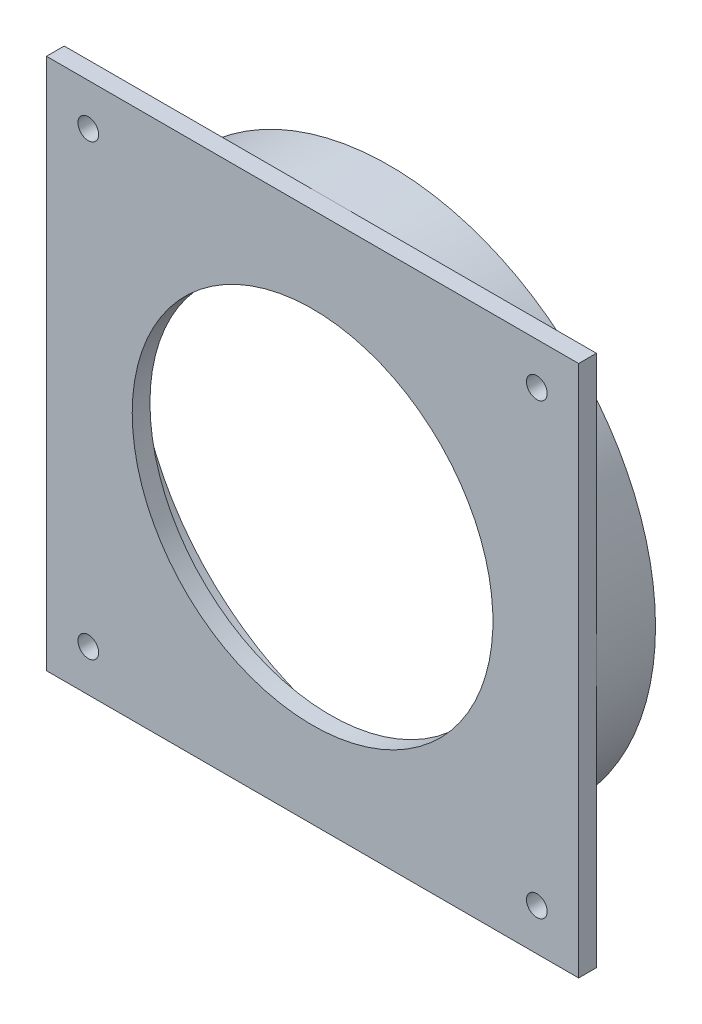
ISO-10303-21;
HEADER;
FILE_DESCRIPTION(('STEP AP214'),'2;1');
FILE_NAME('part.step','',(''),(''),'','','');
FILE_SCHEMA(('AUTOMOTIVE_DESIGN { 1 0 10303 214 1 1 1 1 }'));
ENDSEC;
DATA;
#1=APPLICATION_CONTEXT('core data for automotive mechanical design processes');
#2=APPLICATION_PROTOCOL_DEFINITION('international standard','automotive_design',2000,#1);
#3=PRODUCT_CONTEXT('',#1,'mechanical');
#4=PRODUCT('Part','Part','',(#3));
#5=PRODUCT_RELATED_PRODUCT_CATEGORY('part','',(#4));
#6=PRODUCT_DEFINITION_FORMATION('','',#4);
#7=PRODUCT_DEFINITION_CONTEXT('part definition',#1,'design');
#8=PRODUCT_DEFINITION('design','',#6,#7);
#9=PRODUCT_DEFINITION_SHAPE('','',#8);
#10=(LENGTH_UNIT() NAMED_UNIT(*) SI_UNIT(.MILLI.,.METRE.));
#11=(NAMED_UNIT(*) PLANE_ANGLE_UNIT() SI_UNIT($,.RADIAN.));
#12=(NAMED_UNIT(*) SI_UNIT($,.STERADIAN.) SOLID_ANGLE_UNIT());
#13=UNCERTAINTY_MEASURE_WITH_UNIT(LENGTH_MEASURE(1.E-05),#10,'distance_accuracy_value','');
#14=(GEOMETRIC_REPRESENTATION_CONTEXT(3) GLOBAL_UNCERTAINTY_ASSIGNED_CONTEXT((#13)) GLOBAL_UNIT_ASSIGNED_CONTEXT((#10,
#11,#12)) REPRESENTATION_CONTEXT('',''));
#15=CARTESIAN_POINT('',(0.,0.,0.));
#16=DIRECTION('',(0.,0.,1.));
#17=DIRECTION('',(1.,0.,0.));
#18=AXIS2_PLACEMENT_3D('',#15,#16,#17);
#19=CARTESIAN_POINT('',(0.,0.,0.));
#20=DIRECTION('',(0.,0.,1.));
#21=DIRECTION('',(1.,0.,0.));
#22=AXIS2_PLACEMENT_3D('',#19,#20,#21);
#23=PLANE('',#22);
#24=CARTESIAN_POINT('',(-37.9289321881345,37.9289321881345,0.));
#25=DIRECTION('',(0.,0.,1.));
#26=DIRECTION('',(1.,0.,0.));
#27=AXIS2_PLACEMENT_3D('',#24,#25,#26);
#28=CIRCLE('',#27,1.75);
#29=CARTESIAN_POINT('',(-36.1789321881345,37.9289321881345,0.));
#30=VERTEX_POINT('',#29);
#31=EDGE_CURVE('E250',#30,#30,#28,.T.);
#32=ORIENTED_EDGE('',*,*,#31,.T.);
#33=EDGE_LOOP('',(#32));
#34=FACE_BOUND('',#33,.T.);
#35=CARTESIAN_POINT('',(0.,0.,0.));
#36=DIRECTION('',(0.,0.,-1.));
#37=DIRECTION('',(-1.,0.,0.));
#38=AXIS2_PLACEMENT_3D('',#35,#36,#37);
#39=CIRCLE('',#38,45.);
#40=CARTESIAN_POINT('',(-45.,0.,0.));
#41=VERTEX_POINT('',#40);
#42=CARTESIAN_POINT('',(0.,45.,0.));
#43=VERTEX_POINT('',#42);
#44=EDGE_CURVE('E44',#41,#43,#39,.T.);
#45=ORIENTED_EDGE('',*,*,#44,.F.);
#46=DIRECTION('',(0.,-1.,0.));
#47=VECTOR('',#46,1.);
#48=CARTESIAN_POINT('',(-45.,-45.,0.));
#49=LINE('',#48,#47);
#50=CARTESIAN_POINT('',(-45.,45.,0.));
#51=VERTEX_POINT('',#50);
#52=EDGE_CURVE('E91',#51,#41,#49,.T.);
#53=ORIENTED_EDGE('',*,*,#52,.F.);
#54=DIRECTION('',(-1.,0.,0.));
#55=VECTOR('',#54,1.);
#56=CARTESIAN_POINT('',(45.,45.,0.));
#57=LINE('',#56,#55);
#58=EDGE_CURVE('E108',#43,#51,#57,.T.);
#59=ORIENTED_EDGE('',*,*,#58,.F.);
#60=EDGE_LOOP('',(#45,#53,#59));
#61=FACE_BOUND('',#60,.T.);
#62=ADVANCED_FACE('F33',(#34,#61),#23,.F.);
#63=CARTESIAN_POINT('',(37.9289321881345,37.9289321881345,0.));
#64=DIRECTION('',(0.,0.,1.));
#65=DIRECTION('',(1.,0.,0.));
#66=AXIS2_PLACEMENT_3D('',#63,#64,#65);
#67=CIRCLE('',#66,1.75);
#68=CARTESIAN_POINT('',(39.6789321881345,37.9289321881345,0.));
#69=VERTEX_POINT('',#68);
#70=EDGE_CURVE('E153',#69,#69,#67,.T.);
#71=ORIENTED_EDGE('',*,*,#70,.T.);
#72=EDGE_LOOP('',(#71));
#73=FACE_BOUND('',#72,.T.);
#74=CARTESIAN_POINT('',(45.,0.,0.));
#75=VERTEX_POINT('',#74);
#76=EDGE_CURVE('E11',#43,#75,#39,.T.);
#77=ORIENTED_EDGE('',*,*,#76,.F.);
#78=CARTESIAN_POINT('',(45.,45.,0.));
#79=VERTEX_POINT('',#78);
#80=EDGE_CURVE('E123',#79,#43,#57,.T.);
#81=ORIENTED_EDGE('',*,*,#80,.F.);
#82=DIRECTION('',(0.,1.,0.));
#83=VECTOR('',#82,1.);
#84=CARTESIAN_POINT('',(45.,-45.,0.));
#85=LINE('',#84,#83);
#86=EDGE_CURVE('E130',#75,#79,#85,.T.);
#87=ORIENTED_EDGE('',*,*,#86,.F.);
#88=EDGE_LOOP('',(#77,#81,#87));
#89=FACE_BOUND('',#88,.T.);
#90=ADVANCED_FACE('F180',(#73,#89),#23,.F.);
#91=CARTESIAN_POINT('',(37.9289321881345,-37.9289321881345,0.));
#92=DIRECTION('',(0.,0.,1.));
#93=DIRECTION('',(1.,0.,0.));
#94=AXIS2_PLACEMENT_3D('',#91,#92,#93);
#95=CIRCLE('',#94,1.75);
#96=CARTESIAN_POINT('',(39.6789321881345,-37.9289321881345,0.));
#97=VERTEX_POINT('',#96);
#98=EDGE_CURVE('E148',#97,#97,#95,.T.);
#99=ORIENTED_EDGE('',*,*,#98,.T.);
#100=EDGE_LOOP('',(#99));
#101=FACE_BOUND('',#100,.T.);
#102=CARTESIAN_POINT('',(0.,-45.,0.));
#103=VERTEX_POINT('',#102);
#104=EDGE_CURVE('E42',#75,#103,#39,.T.);
#105=ORIENTED_EDGE('',*,*,#104,.F.);
#106=CARTESIAN_POINT('',(45.,-45.,0.));
#107=VERTEX_POINT('',#106);
#108=EDGE_CURVE('E131',#107,#75,#85,.T.);
#109=ORIENTED_EDGE('',*,*,#108,.F.);
#110=DIRECTION('',(1.,0.,0.));
#111=VECTOR('',#110,1.);
#112=CARTESIAN_POINT('',(45.,-45.,0.));
#113=LINE('',#112,#111);
#114=EDGE_CURVE('E100',#103,#107,#113,.T.);
#115=ORIENTED_EDGE('',*,*,#114,.F.);
#116=EDGE_LOOP('',(#105,#109,#115));
#117=FACE_BOUND('',#116,.T.);
#118=ADVANCED_FACE('F185',(#101,#117),#23,.F.);
#119=CARTESIAN_POINT('',(-45.,-45.,3.));
#120=DIRECTION('',(1.,0.,0.));
#121=DIRECTION('',(0.,0.,-1.));
#122=AXIS2_PLACEMENT_3D('',#119,#120,#121);
#123=PLANE('',#122);
#124=ORIENTED_EDGE('',*,*,#52,.T.);
#125=CARTESIAN_POINT('',(-45.,-45.,0.));
#126=VERTEX_POINT('',#125);
#127=EDGE_CURVE('E93',#41,#126,#49,.T.);
#128=ORIENTED_EDGE('',*,*,#127,.T.);
#129=DIRECTION('',(0.,0.,-1.));
#130=VECTOR('',#129,1.);
#131=CARTESIAN_POINT('',(-45.,-45.,3.));
#132=LINE('',#131,#130);
#133=CARTESIAN_POINT('',(-45.,-45.,3.));
#134=VERTEX_POINT('',#133);
#135=EDGE_CURVE('E113',#134,#126,#132,.T.);
#136=ORIENTED_EDGE('',*,*,#135,.F.);
#137=DIRECTION('',(0.,-1.,0.));
#138=VECTOR('',#137,1.);
#139=CARTESIAN_POINT('',(-45.,-45.,3.));
#140=LINE('',#139,#138);
#141=CARTESIAN_POINT('',(-45.,45.,3.));
#142=VERTEX_POINT('',#141);
#143=EDGE_CURVE('E119',#142,#134,#140,.T.);
#144=ORIENTED_EDGE('',*,*,#143,.F.);
#145=DIRECTION('',(0.,0.,-1.));
#146=VECTOR('',#145,1.);
#147=CARTESIAN_POINT('',(-45.,45.,3.));
#148=LINE('',#147,#146);
#149=EDGE_CURVE('E96',#142,#51,#148,.T.);
#150=ORIENTED_EDGE('',*,*,#149,.T.);
#151=EDGE_LOOP('',(#124,#128,#136,#144,#150));
#152=FACE_BOUND('',#151,.T.);
#153=ADVANCED_FACE('F35',(#152),#123,.F.);
#154=CARTESIAN_POINT('',(45.,-45.,3.));
#155=DIRECTION('',(0.,1.,0.));
#156=DIRECTION('',(-1.,0.,0.));
#157=AXIS2_PLACEMENT_3D('',#154,#155,#156);
#158=PLANE('',#157);
#159=EDGE_CURVE('E104',#126,#103,#113,.T.);
#160=ORIENTED_EDGE('',*,*,#159,.T.);
#161=ORIENTED_EDGE('',*,*,#114,.T.);
#162=DIRECTION('',(0.,0.,-1.));
#163=VECTOR('',#162,1.);
#164=CARTESIAN_POINT('',(45.,-45.,3.));
#165=LINE('',#164,#163);
#166=CARTESIAN_POINT('',(45.,-45.,3.));
#167=VERTEX_POINT('',#166);
#168=EDGE_CURVE('E114',#167,#107,#165,.T.);
#169=ORIENTED_EDGE('',*,*,#168,.F.);
#170=DIRECTION('',(1.,0.,0.));
#171=VECTOR('',#170,1.);
#172=CARTESIAN_POINT('',(45.,-45.,3.));
#173=LINE('',#172,#171);
#174=EDGE_CURVE('E122',#134,#167,#173,.T.);
#175=ORIENTED_EDGE('',*,*,#174,.F.);
#176=ORIENTED_EDGE('',*,*,#135,.T.);
#177=EDGE_LOOP('',(#160,#161,#169,#175,#176));
#178=FACE_BOUND('',#177,.T.);
#179=ADVANCED_FACE('F196',(#178),#158,.F.);
#180=CARTESIAN_POINT('',(45.,-45.,3.));
#181=DIRECTION('',(-1.,0.,0.));
#182=DIRECTION('',(0.,0.,1.));
#183=AXIS2_PLACEMENT_3D('',#180,#181,#182);
#184=PLANE('',#183);
#185=ORIENTED_EDGE('',*,*,#108,.T.);
#186=ORIENTED_EDGE('',*,*,#86,.T.);
#187=DIRECTION('',(0.,0.,-1.));
#188=VECTOR('',#187,1.);
#189=CARTESIAN_POINT('',(45.,45.,3.));
#190=LINE('',#189,#188);
#191=CARTESIAN_POINT('',(45.,45.,3.));
#192=VERTEX_POINT('',#191);
#193=EDGE_CURVE('E136',#192,#79,#190,.T.);
#194=ORIENTED_EDGE('',*,*,#193,.F.);
#195=DIRECTION('',(0.,1.,0.));
#196=VECTOR('',#195,1.);
#197=CARTESIAN_POINT('',(45.,-45.,3.));
#198=LINE('',#197,#196);
#199=EDGE_CURVE('E125',#167,#192,#198,.T.);
#200=ORIENTED_EDGE('',*,*,#199,.F.);
#201=ORIENTED_EDGE('',*,*,#168,.T.);
#202=EDGE_LOOP('',(#185,#186,#194,#200,#201));
#203=FACE_BOUND('',#202,.T.);
#204=ADVANCED_FACE('F193',(#203),#184,.F.);
#205=CARTESIAN_POINT('',(45.,45.,3.));
#206=DIRECTION('',(0.,-1.,0.));
#207=DIRECTION('',(1.,0.,0.));
#208=AXIS2_PLACEMENT_3D('',#205,#206,#207);
#209=PLANE('',#208);
#210=ORIENTED_EDGE('',*,*,#80,.T.);
#211=ORIENTED_EDGE('',*,*,#58,.T.);
#212=ORIENTED_EDGE('',*,*,#149,.F.);
#213=DIRECTION('',(-1.,0.,0.));
#214=VECTOR('',#213,1.);
#215=CARTESIAN_POINT('',(45.,45.,3.));
#216=LINE('',#215,#214);
#217=EDGE_CURVE('E127',#192,#142,#216,.T.);
#218=ORIENTED_EDGE('',*,*,#217,.F.);
#219=ORIENTED_EDGE('',*,*,#193,.T.);
#220=EDGE_LOOP('',(#210,#211,#212,#218,#219));
#221=FACE_BOUND('',#220,.T.);
#222=ADVANCED_FACE('F190',(#221),#209,.F.);
#223=CARTESIAN_POINT('',(0.,0.,3.));
#224=DIRECTION('',(0.,0.,1.));
#225=DIRECTION('',(1.,0.,0.));
#226=AXIS2_PLACEMENT_3D('',#223,#224,#225);
#227=PLANE('',#226);
#228=CARTESIAN_POINT('',(-37.9289321881345,-37.9289321881345,3.));
#229=DIRECTION('',(0.,0.,1.));
#230=DIRECTION('',(1.,0.,0.));
#231=AXIS2_PLACEMENT_3D('',#228,#229,#230);
#232=CIRCLE('',#231,1.75);
#233=CARTESIAN_POINT('',(-36.1789321881345,-37.9289321881345,3.));
#234=VERTEX_POINT('',#233);
#235=EDGE_CURVE('E256',#234,#234,#232,.T.);
#236=ORIENTED_EDGE('',*,*,#235,.F.);
#237=EDGE_LOOP('',(#236));
#238=FACE_BOUND('',#237,.T.);
#239=CARTESIAN_POINT('',(37.9289321881345,-37.9289321881345,3.));
#240=DIRECTION('',(0.,0.,1.));
#241=DIRECTION('',(1.,0.,0.));
#242=AXIS2_PLACEMENT_3D('',#239,#240,#241);
#243=CIRCLE('',#242,1.75);
#244=CARTESIAN_POINT('',(39.6789321881345,-37.9289321881345,3.));
#245=VERTEX_POINT('',#244);
#246=EDGE_CURVE('E259',#245,#245,#243,.T.);
#247=ORIENTED_EDGE('',*,*,#246,.F.);
#248=EDGE_LOOP('',(#247));
#249=FACE_BOUND('',#248,.T.);
#250=CARTESIAN_POINT('',(37.9289321881345,37.9289321881345,3.));
#251=DIRECTION('',(0.,0.,1.));
#252=DIRECTION('',(1.,0.,0.));
#253=AXIS2_PLACEMENT_3D('',#250,#251,#252);
#254=CIRCLE('',#253,1.75);
#255=CARTESIAN_POINT('',(39.6789321881345,37.9289321881345,3.));
#256=VERTEX_POINT('',#255);
#257=EDGE_CURVE('E247',#256,#256,#254,.T.);
#258=ORIENTED_EDGE('',*,*,#257,.F.);
#259=EDGE_LOOP('',(#258));
#260=FACE_BOUND('',#259,.T.);
#261=CARTESIAN_POINT('',(-37.9289321881345,37.9289321881345,3.));
#262=DIRECTION('',(0.,0.,1.));
#263=DIRECTION('',(1.,0.,0.));
#264=AXIS2_PLACEMENT_3D('',#261,#262,#263);
#265=CIRCLE('',#264,1.75);
#266=CARTESIAN_POINT('',(-36.1789321881345,37.9289321881345,3.));
#267=VERTEX_POINT('',#266);
#268=EDGE_CURVE('E253',#267,#267,#265,.T.);
#269=ORIENTED_EDGE('',*,*,#268,.F.);
#270=EDGE_LOOP('',(#269));
#271=FACE_BOUND('',#270,.T.);
#272=CARTESIAN_POINT('',(0.,0.,3.));
#273=DIRECTION('',(0.,0.,1.));
#274=DIRECTION('',(1.,0.,0.));
#275=AXIS2_PLACEMENT_3D('',#272,#273,#274);
#276=CIRCLE('',#275,30.5);
#277=CARTESIAN_POINT('',(-30.5,0.,3.));
#278=VERTEX_POINT('',#277);
#279=EDGE_CURVE('E140',#278,#278,#276,.T.);
#280=ORIENTED_EDGE('',*,*,#279,.F.);
#281=EDGE_LOOP('',(#280));
#282=FACE_BOUND('',#281,.T.);
#283=ORIENTED_EDGE('',*,*,#143,.T.);
#284=ORIENTED_EDGE('',*,*,#174,.T.);
#285=ORIENTED_EDGE('',*,*,#199,.T.);
#286=ORIENTED_EDGE('',*,*,#217,.T.);
#287=EDGE_LOOP('',(#283,#284,#285,#286));
#288=FACE_BOUND('',#287,.T.);
#289=ADVANCED_FACE('F173',(#238,#249,#260,#271,#282,#288),#227,.T.);
#290=CARTESIAN_POINT('',(-37.9289321881345,-37.9289321881345,0.));
#291=DIRECTION('',(0.,0.,1.));
#292=DIRECTION('',(1.,0.,0.));
#293=AXIS2_PLACEMENT_3D('',#290,#291,#292);
#294=CIRCLE('',#293,1.75);
#295=CARTESIAN_POINT('',(-36.1789321881345,-37.9289321881345,0.));
#296=VERTEX_POINT('',#295);
#297=EDGE_CURVE('E37',#296,#296,#294,.T.);
#298=ORIENTED_EDGE('',*,*,#297,.T.);
#299=EDGE_LOOP('',(#298));
#300=FACE_BOUND('',#299,.T.);
#301=EDGE_CURVE('E51',#103,#41,#39,.T.);
#302=ORIENTED_EDGE('',*,*,#301,.F.);
#303=ORIENTED_EDGE('',*,*,#159,.F.);
#304=ORIENTED_EDGE('',*,*,#127,.F.);
#305=EDGE_LOOP('',(#302,#303,#304));
#306=FACE_BOUND('',#305,.T.);
#307=ADVANCED_FACE('F102',(#300,#306),#23,.F.);
#308=CARTESIAN_POINT('',(0.,0.,-10.));
#309=DIRECTION('',(0.,0.,-1.));
#310=DIRECTION('',(-1.,0.,0.));
#311=AXIS2_PLACEMENT_3D('',#308,#309,#310);
#312=PLANE('',#311);
#313=CARTESIAN_POINT('',(0.,0.,-10.));
#314=DIRECTION('',(0.,0.,-1.));
#315=DIRECTION('',(-1.,0.,0.));
#316=AXIS2_PLACEMENT_3D('',#313,#314,#315);
#317=CIRCLE('',#316,45.);
#318=CARTESIAN_POINT('',(-45.,0.,-10.));
#319=VERTEX_POINT('',#318);
#320=EDGE_CURVE('E106',#319,#319,#317,.T.);
#321=ORIENTED_EDGE('',*,*,#320,.T.);
#322=EDGE_LOOP('',(#321));
#323=FACE_BOUND('',#322,.T.);
#324=CARTESIAN_POINT('',(0.,0.,-10.));
#325=DIRECTION('',(0.,0.,-1.));
#326=DIRECTION('',(-1.,0.,0.));
#327=AXIS2_PLACEMENT_3D('',#324,#325,#326);
#328=CIRCLE('',#327,43.);
#329=CARTESIAN_POINT('',(-43.,0.,-10.));
#330=VERTEX_POINT('',#329);
#331=EDGE_CURVE('E111',#330,#330,#328,.T.);
#332=ORIENTED_EDGE('',*,*,#331,.F.);
#333=EDGE_LOOP('',(#332));
#334=FACE_BOUND('',#333,.T.);
#335=ADVANCED_FACE('F163',(#323,#334),#312,.T.);
#336=CARTESIAN_POINT('',(0.,0.,-10.));
#337=DIRECTION('',(0.,0.,1.));
#338=DIRECTION('',(1.,0.,0.));
#339=AXIS2_PLACEMENT_3D('',#336,#337,#338);
#340=CYLINDRICAL_SURFACE('',#339,45.);
#341=ORIENTED_EDGE('',*,*,#320,.F.);
#342=EDGE_LOOP('',(#341));
#343=FACE_BOUND('',#342,.T.);
#344=ORIENTED_EDGE('',*,*,#44,.T.);
#345=ORIENTED_EDGE('',*,*,#76,.T.);
#346=ORIENTED_EDGE('',*,*,#104,.T.);
#347=ORIENTED_EDGE('',*,*,#301,.T.);
#348=EDGE_LOOP('',(#344,#345,#346,#347));
#349=FACE_BOUND('',#348,.T.);
#350=ADVANCED_FACE('F112',(#343,#349),#340,.T.);
#351=CARTESIAN_POINT('',(0.,0.,-10.));
#352=DIRECTION('',(0.,0.,1.));
#353=DIRECTION('',(1.,0.,0.));
#354=AXIS2_PLACEMENT_3D('',#351,#352,#353);
#355=CYLINDRICAL_SURFACE('',#354,43.);
#356=ORIENTED_EDGE('',*,*,#331,.T.);
#357=EDGE_LOOP('',(#356));
#358=FACE_BOUND('',#357,.T.);
#359=CARTESIAN_POINT('',(0.,0.,0.));
#360=DIRECTION('',(0.,0.,-1.));
#361=DIRECTION('',(-1.,0.,0.));
#362=AXIS2_PLACEMENT_3D('',#359,#360,#361);
#363=CIRCLE('',#362,43.);
#364=CARTESIAN_POINT('',(-43.,0.,0.));
#365=VERTEX_POINT('',#364);
#366=EDGE_CURVE('E142',#365,#365,#363,.T.);
#367=ORIENTED_EDGE('',*,*,#366,.F.);
#368=EDGE_LOOP('',(#367));
#369=FACE_BOUND('',#368,.T.);
#370=ADVANCED_FACE('F160',(#358,#369),#355,.F.);
#371=CARTESIAN_POINT('',(0.,0.,0.));
#372=DIRECTION('',(0.,0.,-1.));
#373=DIRECTION('',(-1.,0.,0.));
#374=AXIS2_PLACEMENT_3D('',#371,#372,#373);
#375=CIRCLE('',#374,30.5);
#376=CARTESIAN_POINT('',(-30.5,0.,0.));
#377=VERTEX_POINT('',#376);
#378=EDGE_CURVE('E143',#377,#377,#375,.T.);
#379=ORIENTED_EDGE('',*,*,#378,.F.);
#380=EDGE_LOOP('',(#379));
#381=FACE_BOUND('',#380,.T.);
#382=ORIENTED_EDGE('',*,*,#366,.T.);
#383=EDGE_LOOP('',(#382));
#384=FACE_BOUND('',#383,.T.);
#385=ADVANCED_FACE('F176',(#381,#384),#23,.F.);
#386=CARTESIAN_POINT('',(0.,0.,58.));
#387=DIRECTION('',(0.,0.,-1.));
#388=DIRECTION('',(-1.,0.,0.));
#389=AXIS2_PLACEMENT_3D('',#386,#387,#388);
#390=CYLINDRICAL_SURFACE('',#389,30.5);
#391=CARTESIAN_POINT('',(-30.5,0.,3.));
#392=CARTESIAN_POINT('',(-30.5,0.,2.96875));
#393=CARTESIAN_POINT('',(-30.5,0.,2.9375));
#394=CARTESIAN_POINT('',(-30.5,0.,2.875));
#395=CARTESIAN_POINT('',(-30.5,0.,2.84375));
#396=CARTESIAN_POINT('',(-30.5,0.,2.78125));
#397=CARTESIAN_POINT('',(-30.5,0.,2.75));
#398=CARTESIAN_POINT('',(-30.5,0.,2.6875));
#399=CARTESIAN_POINT('',(-30.5,0.,2.65625));
#400=CARTESIAN_POINT('',(-30.5,0.,2.59375));
#401=CARTESIAN_POINT('',(-30.5,0.,2.5625));
#402=CARTESIAN_POINT('',(-30.5,0.,2.5));
#403=CARTESIAN_POINT('',(-30.5,0.,2.46875));
#404=CARTESIAN_POINT('',(-30.5,0.,2.40625));
#405=CARTESIAN_POINT('',(-30.5,0.,2.375));
#406=CARTESIAN_POINT('',(-30.5,0.,2.3125));
#407=CARTESIAN_POINT('',(-30.5,0.,2.28125));
#408=CARTESIAN_POINT('',(-30.5,0.,2.21875));
#409=CARTESIAN_POINT('',(-30.5,0.,2.1875));
#410=CARTESIAN_POINT('',(-30.5,0.,2.125));
#411=CARTESIAN_POINT('',(-30.5,0.,2.09375));
#412=CARTESIAN_POINT('',(-30.5,0.,2.03125));
#413=CARTESIAN_POINT('',(-30.5,0.,2.));
#414=CARTESIAN_POINT('',(-30.5,0.,1.9375));
#415=CARTESIAN_POINT('',(-30.5,0.,1.90625));
#416=CARTESIAN_POINT('',(-30.5,0.,1.84375));
#417=CARTESIAN_POINT('',(-30.5,0.,1.8125));
#418=CARTESIAN_POINT('',(-30.5,0.,1.75));
#419=CARTESIAN_POINT('',(-30.5,0.,1.71875));
#420=CARTESIAN_POINT('',(-30.5,0.,1.65625));
#421=CARTESIAN_POINT('',(-30.5,0.,1.625));
#422=CARTESIAN_POINT('',(-30.5,0.,1.5625));
#423=CARTESIAN_POINT('',(-30.5,0.,1.53125));
#424=CARTESIAN_POINT('',(-30.5,0.,1.46875));
#425=CARTESIAN_POINT('',(-30.5,0.,1.4375));
#426=CARTESIAN_POINT('',(-30.5,0.,1.375));
#427=CARTESIAN_POINT('',(-30.5,0.,1.34375));
#428=CARTESIAN_POINT('',(-30.5,0.,1.28125));
#429=CARTESIAN_POINT('',(-30.5,0.,1.25));
#430=CARTESIAN_POINT('',(-30.5,0.,1.1875));
#431=CARTESIAN_POINT('',(-30.5,0.,1.15625));
#432=CARTESIAN_POINT('',(-30.5,0.,1.09375));
#433=CARTESIAN_POINT('',(-30.5,0.,1.0625));
#434=CARTESIAN_POINT('',(-30.5,0.,0.999999999999999));
#435=CARTESIAN_POINT('',(-30.5,0.,0.96875));
#436=CARTESIAN_POINT('',(-30.5,0.,0.906250000000002));
#437=CARTESIAN_POINT('',(-30.5,0.,0.875000000000003));
#438=CARTESIAN_POINT('',(-30.5,0.,0.812500000000003));
#439=CARTESIAN_POINT('',(-30.5,0.,0.781250000000002));
#440=CARTESIAN_POINT('',(-30.5,0.,0.718749999999999));
#441=CARTESIAN_POINT('',(-30.5,0.,0.687499999999998));
#442=CARTESIAN_POINT('',(-30.5,0.,0.624999999999998));
#443=CARTESIAN_POINT('',(-30.5,0.,0.593749999999999));
#444=CARTESIAN_POINT('',(-30.5,0.,0.531250000000002));
#445=CARTESIAN_POINT('',(-30.5,0.,0.500000000000003));
#446=CARTESIAN_POINT('',(-30.5,0.,0.437500000000003));
#447=CARTESIAN_POINT('',(-30.5,0.,0.406250000000002));
#448=CARTESIAN_POINT('',(-30.5,0.,0.343749999999999));
#449=CARTESIAN_POINT('',(-30.5,0.,0.312499999999998));
#450=CARTESIAN_POINT('',(-30.5,0.,0.249999999999998));
#451=CARTESIAN_POINT('',(-30.5,0.,0.218749999999999));
#452=CARTESIAN_POINT('',(-30.5,0.,0.156250000000001));
#453=CARTESIAN_POINT('',(-30.5,0.,0.125000000000002));
#454=CARTESIAN_POINT('',(-30.5,0.,0.0625000000000024));
#455=CARTESIAN_POINT('',(-30.5,0.,0.0312500000000012));
#456=CARTESIAN_POINT('',(-30.5,0.,0.));
#457=B_SPLINE_CURVE_WITH_KNOTS('',3,(#391,#392,#393,#394,#395,#396,#397,#398,#399,#400,#401,
#402,#403,#404,#405,#406,#407,#408,#409,#410,#411,#412,#413,#414,#415,#416,#417,#418,#419,#420,
#421,#422,#423,#424,#425,#426,#427,#428,#429,#430,#431,#432,#433,#434,#435,#436,#437,#438,#439,
#440,#441,#442,#443,#444,#445,#446,#447,#448,#449,#450,#451,#452,#453,#454,#455,#456),
.UNSPECIFIED.,.F.,.F.,(4,2,2,2,2,2,2,2,2,2,2,2,2,2,2,2,2,2,2,2,2,2,2,2,2,2,2,2,2,2,2,2,4),(0.,
0.0937500000000036,0.1875,0.281249999999997,0.375,0.468750000000004,0.5625,0.656249999999997,
0.750000000000001,0.843750000000004,0.937500000000001,1.03125,1.125,1.21875,1.3125,1.40625,1.5,
1.59375,1.6875,1.78125,1.875,1.96875000000001,2.0625,2.15625,2.25,2.34375000000001,2.4375,
2.53125,2.625,2.71875000000001,2.8125,2.90625,3.),.UNSPECIFIED.);
#458=EDGE_CURVE('BSEAM215',#278,#377,#457,.T.);
#459=ORIENTED_EDGE('',*,*,#279,.T.);
#460=ORIENTED_EDGE('',*,*,#378,.T.);
#461=ORIENTED_EDGE('',*,*,#458,.T.);
#462=ORIENTED_EDGE('',*,*,#458,.F.);
#463=EDGE_LOOP('',(#459,#461,#460,#462));
#464=FACE_BOUND('',#463,.T.);
#465=ADVANCED_FACE('F215',(#464),#390,.F.);
#466=CARTESIAN_POINT('',(-37.9289321881345,-37.9289321881345,-55.));
#467=DIRECTION('',(0.,0.,1.));
#468=DIRECTION('',(1.,0.,0.));
#469=AXIS2_PLACEMENT_3D('',#466,#467,#468);
#470=CYLINDRICAL_SURFACE('',#469,1.75);
#471=CARTESIAN_POINT('',(-36.1789321881345,-37.9289321881345,3.));
#472=CARTESIAN_POINT('',(-36.1789321881345,-37.9289321881345,2.96875));
#473=CARTESIAN_POINT('',(-36.1789321881345,-37.9289321881345,2.9375));
#474=CARTESIAN_POINT('',(-36.1789321881345,-37.9289321881345,2.875));
#475=CARTESIAN_POINT('',(-36.1789321881345,-37.9289321881345,2.84375));
#476=CARTESIAN_POINT('',(-36.1789321881345,-37.9289321881345,2.78125));
#477=CARTESIAN_POINT('',(-36.1789321881345,-37.9289321881345,2.75));
#478=CARTESIAN_POINT('',(-36.1789321881345,-37.9289321881345,2.6875));
#479=CARTESIAN_POINT('',(-36.1789321881345,-37.9289321881345,2.65625));
#480=CARTESIAN_POINT('',(-36.1789321881345,-37.9289321881345,2.59375));
#481=CARTESIAN_POINT('',(-36.1789321881345,-37.9289321881345,2.5625));
#482=CARTESIAN_POINT('',(-36.1789321881345,-37.9289321881345,2.5));
#483=CARTESIAN_POINT('',(-36.1789321881345,-37.9289321881345,2.46875));
#484=CARTESIAN_POINT('',(-36.1789321881345,-37.9289321881345,2.40625));
#485=CARTESIAN_POINT('',(-36.1789321881345,-37.9289321881345,2.375));
#486=CARTESIAN_POINT('',(-36.1789321881345,-37.9289321881345,2.3125));
#487=CARTESIAN_POINT('',(-36.1789321881345,-37.9289321881345,2.28125));
#488=CARTESIAN_POINT('',(-36.1789321881345,-37.9289321881345,2.21875));
#489=CARTESIAN_POINT('',(-36.1789321881345,-37.9289321881345,2.1875));
#490=CARTESIAN_POINT('',(-36.1789321881345,-37.9289321881345,2.125));
#491=CARTESIAN_POINT('',(-36.1789321881345,-37.9289321881345,2.09375));
#492=CARTESIAN_POINT('',(-36.1789321881345,-37.9289321881345,2.03125));
#493=CARTESIAN_POINT('',(-36.1789321881345,-37.9289321881345,2.));
#494=CARTESIAN_POINT('',(-36.1789321881345,-37.9289321881345,1.9375));
#495=CARTESIAN_POINT('',(-36.1789321881345,-37.9289321881345,1.90625));
#496=CARTESIAN_POINT('',(-36.1789321881345,-37.9289321881345,1.84375));
#497=CARTESIAN_POINT('',(-36.1789321881345,-37.9289321881345,1.8125));
#498=CARTESIAN_POINT('',(-36.1789321881345,-37.9289321881345,1.75));
#499=CARTESIAN_POINT('',(-36.1789321881345,-37.9289321881345,1.71875));
#500=CARTESIAN_POINT('',(-36.1789321881345,-37.9289321881345,1.65625));
#501=CARTESIAN_POINT('',(-36.1789321881345,-37.9289321881345,1.625));
#502=CARTESIAN_POINT('',(-36.1789321881345,-37.9289321881345,1.5625));
#503=CARTESIAN_POINT('',(-36.1789321881345,-37.9289321881345,1.53125));
#504=CARTESIAN_POINT('',(-36.1789321881345,-37.9289321881345,1.46875));
#505=CARTESIAN_POINT('',(-36.1789321881345,-37.9289321881345,1.4375));
#506=CARTESIAN_POINT('',(-36.1789321881345,-37.9289321881345,1.375));
#507=CARTESIAN_POINT('',(-36.1789321881345,-37.9289321881345,1.34375));
#508=CARTESIAN_POINT('',(-36.1789321881345,-37.9289321881345,1.28125));
#509=CARTESIAN_POINT('',(-36.1789321881345,-37.9289321881345,1.25));
#510=CARTESIAN_POINT('',(-36.1789321881345,-37.9289321881345,1.1875));
#511=CARTESIAN_POINT('',(-36.1789321881345,-37.9289321881345,1.15625));
#512=CARTESIAN_POINT('',(-36.1789321881345,-37.9289321881345,1.09375));
#513=CARTESIAN_POINT('',(-36.1789321881345,-37.9289321881345,1.0625));
#514=CARTESIAN_POINT('',(-36.1789321881345,-37.9289321881345,0.999999999999999));
#515=CARTESIAN_POINT('',(-36.1789321881345,-37.9289321881345,0.96875));
#516=CARTESIAN_POINT('',(-36.1789321881345,-37.9289321881345,0.906250000000002));
#517=CARTESIAN_POINT('',(-36.1789321881345,-37.9289321881345,0.875000000000003));
#518=CARTESIAN_POINT('',(-36.1789321881345,-37.9289321881345,0.812500000000003));
#519=CARTESIAN_POINT('',(-36.1789321881345,-37.9289321881345,0.781250000000002));
#520=CARTESIAN_POINT('',(-36.1789321881345,-37.9289321881345,0.718749999999999));
#521=CARTESIAN_POINT('',(-36.1789321881345,-37.9289321881345,0.687499999999998));
#522=CARTESIAN_POINT('',(-36.1789321881345,-37.9289321881345,0.624999999999998));
#523=CARTESIAN_POINT('',(-36.1789321881345,-37.9289321881345,0.593749999999999));
#524=CARTESIAN_POINT('',(-36.1789321881345,-37.9289321881345,0.531250000000002));
#525=CARTESIAN_POINT('',(-36.1789321881345,-37.9289321881345,0.500000000000003));
#526=CARTESIAN_POINT('',(-36.1789321881345,-37.9289321881345,0.437500000000003));
#527=CARTESIAN_POINT('',(-36.1789321881345,-37.9289321881345,0.406250000000002));
#528=CARTESIAN_POINT('',(-36.1789321881345,-37.9289321881345,0.343749999999999));
#529=CARTESIAN_POINT('',(-36.1789321881345,-37.9289321881345,0.312499999999998));
#530=CARTESIAN_POINT('',(-36.1789321881345,-37.9289321881345,0.249999999999998));
#531=CARTESIAN_POINT('',(-36.1789321881345,-37.9289321881345,0.218749999999999));
#532=CARTESIAN_POINT('',(-36.1789321881345,-37.9289321881345,0.156250000000001));
#533=CARTESIAN_POINT('',(-36.1789321881345,-37.9289321881345,0.125000000000002));
#534=CARTESIAN_POINT('',(-36.1789321881345,-37.9289321881345,0.0625000000000024));
#535=CARTESIAN_POINT('',(-36.1789321881345,-37.9289321881345,0.0312500000000012));
#536=CARTESIAN_POINT('',(-36.1789321881345,-37.9289321881345,0.));
#537=B_SPLINE_CURVE_WITH_KNOTS('',3,(#471,#472,#473,#474,#475,#476,#477,#478,#479,#480,#481,
#482,#483,#484,#485,#486,#487,#488,#489,#490,#491,#492,#493,#494,#495,#496,#497,#498,#499,#500,
#501,#502,#503,#504,#505,#506,#507,#508,#509,#510,#511,#512,#513,#514,#515,#516,#517,#518,#519,
#520,#521,#522,#523,#524,#525,#526,#527,#528,#529,#530,#531,#532,#533,#534,#535,#536),
.UNSPECIFIED.,.F.,.F.,(4,2,2,2,2,2,2,2,2,2,2,2,2,2,2,2,2,2,2,2,2,2,2,2,2,2,2,2,2,2,2,2,4),(0.,
0.0937500000000036,0.1875,0.281249999999997,0.375,0.468750000000004,0.5625,0.656249999999997,
0.750000000000001,0.843750000000004,0.937500000000001,1.03125,1.125,1.21875,1.3125,1.40625,1.5,
1.59375,1.6875,1.78125,1.875,1.96875000000001,2.0625,2.15625,2.25,2.34375000000001,2.4375,
2.53125,2.625,2.71875000000001,2.8125,2.90625,3.),.UNSPECIFIED.);
#538=EDGE_CURVE('BSEAM221',#234,#296,#537,.T.);
#539=ORIENTED_EDGE('',*,*,#235,.T.);
#540=ORIENTED_EDGE('',*,*,#297,.F.);
#541=ORIENTED_EDGE('',*,*,#538,.T.);
#542=ORIENTED_EDGE('',*,*,#538,.F.);
#543=EDGE_LOOP('',(#539,#541,#540,#542));
#544=FACE_BOUND('',#543,.T.);
#545=ADVANCED_FACE('F221',(#544),#470,.F.);
#546=CARTESIAN_POINT('',(-37.9289321881345,37.9289321881345,-55.));
#547=DIRECTION('',(0.,0.,1.));
#548=DIRECTION('',(1.,0.,0.));
#549=AXIS2_PLACEMENT_3D('',#546,#547,#548);
#550=CYLINDRICAL_SURFACE('',#549,1.75);
#551=CARTESIAN_POINT('',(-36.1789321881345,37.9289321881345,3.));
#552=CARTESIAN_POINT('',(-36.1789321881345,37.9289321881345,2.96875));
#553=CARTESIAN_POINT('',(-36.1789321881345,37.9289321881345,2.9375));
#554=CARTESIAN_POINT('',(-36.1789321881345,37.9289321881345,2.875));
#555=CARTESIAN_POINT('',(-36.1789321881345,37.9289321881345,2.84375));
#556=CARTESIAN_POINT('',(-36.1789321881345,37.9289321881345,2.78125));
#557=CARTESIAN_POINT('',(-36.1789321881345,37.9289321881345,2.75));
#558=CARTESIAN_POINT('',(-36.1789321881345,37.9289321881345,2.6875));
#559=CARTESIAN_POINT('',(-36.1789321881345,37.9289321881345,2.65625));
#560=CARTESIAN_POINT('',(-36.1789321881345,37.9289321881345,2.59375));
#561=CARTESIAN_POINT('',(-36.1789321881345,37.9289321881345,2.5625));
#562=CARTESIAN_POINT('',(-36.1789321881345,37.9289321881345,2.5));
#563=CARTESIAN_POINT('',(-36.1789321881345,37.9289321881345,2.46875));
#564=CARTESIAN_POINT('',(-36.1789321881345,37.9289321881345,2.40625));
#565=CARTESIAN_POINT('',(-36.1789321881345,37.9289321881345,2.375));
#566=CARTESIAN_POINT('',(-36.1789321881345,37.9289321881345,2.3125));
#567=CARTESIAN_POINT('',(-36.1789321881345,37.9289321881345,2.28125));
#568=CARTESIAN_POINT('',(-36.1789321881345,37.9289321881345,2.21875));
#569=CARTESIAN_POINT('',(-36.1789321881345,37.9289321881345,2.1875));
#570=CARTESIAN_POINT('',(-36.1789321881345,37.9289321881345,2.125));
#571=CARTESIAN_POINT('',(-36.1789321881345,37.9289321881345,2.09375));
#572=CARTESIAN_POINT('',(-36.1789321881345,37.9289321881345,2.03125));
#573=CARTESIAN_POINT('',(-36.1789321881345,37.9289321881345,2.));
#574=CARTESIAN_POINT('',(-36.1789321881345,37.9289321881345,1.9375));
#575=CARTESIAN_POINT('',(-36.1789321881345,37.9289321881345,1.90625));
#576=CARTESIAN_POINT('',(-36.1789321881345,37.9289321881345,1.84375));
#577=CARTESIAN_POINT('',(-36.1789321881345,37.9289321881345,1.8125));
#578=CARTESIAN_POINT('',(-36.1789321881345,37.9289321881345,1.75));
#579=CARTESIAN_POINT('',(-36.1789321881345,37.9289321881345,1.71875));
#580=CARTESIAN_POINT('',(-36.1789321881345,37.9289321881345,1.65625));
#581=CARTESIAN_POINT('',(-36.1789321881345,37.9289321881345,1.625));
#582=CARTESIAN_POINT('',(-36.1789321881345,37.9289321881345,1.5625));
#583=CARTESIAN_POINT('',(-36.1789321881345,37.9289321881345,1.53125));
#584=CARTESIAN_POINT('',(-36.1789321881345,37.9289321881345,1.46875));
#585=CARTESIAN_POINT('',(-36.1789321881345,37.9289321881345,1.4375));
#586=CARTESIAN_POINT('',(-36.1789321881345,37.9289321881345,1.375));
#587=CARTESIAN_POINT('',(-36.1789321881345,37.9289321881345,1.34375));
#588=CARTESIAN_POINT('',(-36.1789321881345,37.9289321881345,1.28125));
#589=CARTESIAN_POINT('',(-36.1789321881345,37.9289321881345,1.25));
#590=CARTESIAN_POINT('',(-36.1789321881345,37.9289321881345,1.1875));
#591=CARTESIAN_POINT('',(-36.1789321881345,37.9289321881345,1.15625));
#592=CARTESIAN_POINT('',(-36.1789321881345,37.9289321881345,1.09375));
#593=CARTESIAN_POINT('',(-36.1789321881345,37.9289321881345,1.0625));
#594=CARTESIAN_POINT('',(-36.1789321881345,37.9289321881345,0.999999999999999));
#595=CARTESIAN_POINT('',(-36.1789321881345,37.9289321881345,0.96875));
#596=CARTESIAN_POINT('',(-36.1789321881345,37.9289321881345,0.906250000000002));
#597=CARTESIAN_POINT('',(-36.1789321881345,37.9289321881345,0.875000000000003));
#598=CARTESIAN_POINT('',(-36.1789321881345,37.9289321881345,0.812500000000003));
#599=CARTESIAN_POINT('',(-36.1789321881345,37.9289321881345,0.781250000000002));
#600=CARTESIAN_POINT('',(-36.1789321881345,37.9289321881345,0.718749999999999));
#601=CARTESIAN_POINT('',(-36.1789321881345,37.9289321881345,0.687499999999998));
#602=CARTESIAN_POINT('',(-36.1789321881345,37.9289321881345,0.624999999999998));
#603=CARTESIAN_POINT('',(-36.1789321881345,37.9289321881345,0.593749999999999));
#604=CARTESIAN_POINT('',(-36.1789321881345,37.9289321881345,0.531250000000002));
#605=CARTESIAN_POINT('',(-36.1789321881345,37.9289321881345,0.500000000000003));
#606=CARTESIAN_POINT('',(-36.1789321881345,37.9289321881345,0.437500000000003));
#607=CARTESIAN_POINT('',(-36.1789321881345,37.9289321881345,0.406250000000002));
#608=CARTESIAN_POINT('',(-36.1789321881345,37.9289321881345,0.343749999999999));
#609=CARTESIAN_POINT('',(-36.1789321881345,37.9289321881345,0.312499999999998));
#610=CARTESIAN_POINT('',(-36.1789321881345,37.9289321881345,0.249999999999998));
#611=CARTESIAN_POINT('',(-36.1789321881345,37.9289321881345,0.218749999999999));
#612=CARTESIAN_POINT('',(-36.1789321881345,37.9289321881345,0.156250000000001));
#613=CARTESIAN_POINT('',(-36.1789321881345,37.9289321881345,0.125000000000002));
#614=CARTESIAN_POINT('',(-36.1789321881345,37.9289321881345,0.0625000000000024));
#615=CARTESIAN_POINT('',(-36.1789321881345,37.9289321881345,0.0312500000000012));
#616=CARTESIAN_POINT('',(-36.1789321881345,37.9289321881345,0.));
#617=B_SPLINE_CURVE_WITH_KNOTS('',3,(#551,#552,#553,#554,#555,#556,#557,#558,#559,#560,#561,
#562,#563,#564,#565,#566,#567,#568,#569,#570,#571,#572,#573,#574,#575,#576,#577,#578,#579,#580,
#581,#582,#583,#584,#585,#586,#587,#588,#589,#590,#591,#592,#593,#594,#595,#596,#597,#598,#599,
#600,#601,#602,#603,#604,#605,#606,#607,#608,#609,#610,#611,#612,#613,#614,#615,#616),
.UNSPECIFIED.,.F.,.F.,(4,2,2,2,2,2,2,2,2,2,2,2,2,2,2,2,2,2,2,2,2,2,2,2,2,2,2,2,2,2,2,2,4),(0.,
0.0937500000000036,0.1875,0.281249999999997,0.375,0.468750000000004,0.5625,0.656249999999997,
0.750000000000001,0.843750000000004,0.937500000000001,1.03125,1.125,1.21875,1.3125,1.40625,1.5,
1.59375,1.6875,1.78125,1.875,1.96875000000001,2.0625,2.15625,2.25,2.34375000000001,2.4375,
2.53125,2.625,2.71875000000001,2.8125,2.90625,3.),.UNSPECIFIED.);
#618=EDGE_CURVE('BSEAM228',#267,#30,#617,.T.);
#619=ORIENTED_EDGE('',*,*,#268,.T.);
#620=ORIENTED_EDGE('',*,*,#31,.F.);
#621=ORIENTED_EDGE('',*,*,#618,.T.);
#622=ORIENTED_EDGE('',*,*,#618,.F.);
#623=EDGE_LOOP('',(#619,#621,#620,#622));
#624=FACE_BOUND('',#623,.T.);
#625=ADVANCED_FACE('F228',(#624),#550,.F.);
#626=CARTESIAN_POINT('',(37.9289321881345,37.9289321881345,-55.));
#627=DIRECTION('',(0.,0.,1.));
#628=DIRECTION('',(1.,0.,0.));
#629=AXIS2_PLACEMENT_3D('',#626,#627,#628);
#630=CYLINDRICAL_SURFACE('',#629,1.75);
#631=CARTESIAN_POINT('',(39.6789321881345,37.9289321881345,3.));
#632=CARTESIAN_POINT('',(39.6789321881345,37.9289321881345,2.96875));
#633=CARTESIAN_POINT('',(39.6789321881345,37.9289321881345,2.9375));
#634=CARTESIAN_POINT('',(39.6789321881345,37.9289321881345,2.875));
#635=CARTESIAN_POINT('',(39.6789321881345,37.9289321881345,2.84375));
#636=CARTESIAN_POINT('',(39.6789321881345,37.9289321881345,2.78125));
#637=CARTESIAN_POINT('',(39.6789321881345,37.9289321881345,2.75));
#638=CARTESIAN_POINT('',(39.6789321881345,37.9289321881345,2.6875));
#639=CARTESIAN_POINT('',(39.6789321881345,37.9289321881345,2.65625));
#640=CARTESIAN_POINT('',(39.6789321881345,37.9289321881345,2.59375));
#641=CARTESIAN_POINT('',(39.6789321881345,37.9289321881345,2.5625));
#642=CARTESIAN_POINT('',(39.6789321881345,37.9289321881345,2.5));
#643=CARTESIAN_POINT('',(39.6789321881345,37.9289321881345,2.46875));
#644=CARTESIAN_POINT('',(39.6789321881345,37.9289321881345,2.40625));
#645=CARTESIAN_POINT('',(39.6789321881345,37.9289321881345,2.375));
#646=CARTESIAN_POINT('',(39.6789321881345,37.9289321881345,2.3125));
#647=CARTESIAN_POINT('',(39.6789321881345,37.9289321881345,2.28125));
#648=CARTESIAN_POINT('',(39.6789321881345,37.9289321881345,2.21875));
#649=CARTESIAN_POINT('',(39.6789321881345,37.9289321881345,2.1875));
#650=CARTESIAN_POINT('',(39.6789321881345,37.9289321881345,2.125));
#651=CARTESIAN_POINT('',(39.6789321881345,37.9289321881345,2.09375));
#652=CARTESIAN_POINT('',(39.6789321881345,37.9289321881345,2.03125));
#653=CARTESIAN_POINT('',(39.6789321881345,37.9289321881345,2.));
#654=CARTESIAN_POINT('',(39.6789321881345,37.9289321881345,1.9375));
#655=CARTESIAN_POINT('',(39.6789321881345,37.9289321881345,1.90625));
#656=CARTESIAN_POINT('',(39.6789321881345,37.9289321881345,1.84375));
#657=CARTESIAN_POINT('',(39.6789321881345,37.9289321881345,1.8125));
#658=CARTESIAN_POINT('',(39.6789321881345,37.9289321881345,1.75));
#659=CARTESIAN_POINT('',(39.6789321881345,37.9289321881345,1.71875));
#660=CARTESIAN_POINT('',(39.6789321881345,37.9289321881345,1.65625));
#661=CARTESIAN_POINT('',(39.6789321881345,37.9289321881345,1.625));
#662=CARTESIAN_POINT('',(39.6789321881345,37.9289321881345,1.5625));
#663=CARTESIAN_POINT('',(39.6789321881345,37.9289321881345,1.53125));
#664=CARTESIAN_POINT('',(39.6789321881345,37.9289321881345,1.46875));
#665=CARTESIAN_POINT('',(39.6789321881345,37.9289321881345,1.4375));
#666=CARTESIAN_POINT('',(39.6789321881345,37.9289321881345,1.375));
#667=CARTESIAN_POINT('',(39.6789321881345,37.9289321881345,1.34375));
#668=CARTESIAN_POINT('',(39.6789321881345,37.9289321881345,1.28125));
#669=CARTESIAN_POINT('',(39.6789321881345,37.9289321881345,1.25));
#670=CARTESIAN_POINT('',(39.6789321881345,37.9289321881345,1.1875));
#671=CARTESIAN_POINT('',(39.6789321881345,37.9289321881345,1.15625));
#672=CARTESIAN_POINT('',(39.6789321881345,37.9289321881345,1.09375));
#673=CARTESIAN_POINT('',(39.6789321881345,37.9289321881345,1.0625));
#674=CARTESIAN_POINT('',(39.6789321881345,37.9289321881345,0.999999999999999));
#675=CARTESIAN_POINT('',(39.6789321881345,37.9289321881345,0.96875));
#676=CARTESIAN_POINT('',(39.6789321881345,37.9289321881345,0.906250000000002));
#677=CARTESIAN_POINT('',(39.6789321881345,37.9289321881345,0.875000000000003));
#678=CARTESIAN_POINT('',(39.6789321881345,37.9289321881345,0.812500000000003));
#679=CARTESIAN_POINT('',(39.6789321881345,37.9289321881345,0.781250000000002));
#680=CARTESIAN_POINT('',(39.6789321881345,37.9289321881345,0.718749999999999));
#681=CARTESIAN_POINT('',(39.6789321881345,37.9289321881345,0.687499999999998));
#682=CARTESIAN_POINT('',(39.6789321881345,37.9289321881345,0.624999999999998));
#683=CARTESIAN_POINT('',(39.6789321881345,37.9289321881345,0.593749999999999));
#684=CARTESIAN_POINT('',(39.6789321881345,37.9289321881345,0.531250000000002));
#685=CARTESIAN_POINT('',(39.6789321881345,37.9289321881345,0.500000000000003));
#686=CARTESIAN_POINT('',(39.6789321881345,37.9289321881345,0.437500000000003));
#687=CARTESIAN_POINT('',(39.6789321881345,37.9289321881345,0.406250000000002));
#688=CARTESIAN_POINT('',(39.6789321881345,37.9289321881345,0.343749999999999));
#689=CARTESIAN_POINT('',(39.6789321881345,37.9289321881345,0.312499999999998));
#690=CARTESIAN_POINT('',(39.6789321881345,37.9289321881345,0.249999999999998));
#691=CARTESIAN_POINT('',(39.6789321881345,37.9289321881345,0.218749999999999));
#692=CARTESIAN_POINT('',(39.6789321881345,37.9289321881345,0.156250000000001));
#693=CARTESIAN_POINT('',(39.6789321881345,37.9289321881345,0.125000000000002));
#694=CARTESIAN_POINT('',(39.6789321881345,37.9289321881345,0.0625000000000024));
#695=CARTESIAN_POINT('',(39.6789321881345,37.9289321881345,0.0312500000000012));
#696=CARTESIAN_POINT('',(39.6789321881345,37.9289321881345,0.));
#697=B_SPLINE_CURVE_WITH_KNOTS('',3,(#631,#632,#633,#634,#635,#636,#637,#638,#639,#640,#641,
#642,#643,#644,#645,#646,#647,#648,#649,#650,#651,#652,#653,#654,#655,#656,#657,#658,#659,#660,
#661,#662,#663,#664,#665,#666,#667,#668,#669,#670,#671,#672,#673,#674,#675,#676,#677,#678,#679,
#680,#681,#682,#683,#684,#685,#686,#687,#688,#689,#690,#691,#692,#693,#694,#695,#696),
.UNSPECIFIED.,.F.,.F.,(4,2,2,2,2,2,2,2,2,2,2,2,2,2,2,2,2,2,2,2,2,2,2,2,2,2,2,2,2,2,2,2,4),(0.,
0.0937500000000036,0.1875,0.281249999999997,0.375,0.468750000000004,0.5625,0.656249999999997,
0.750000000000001,0.843750000000004,0.937500000000001,1.03125,1.125,1.21875,1.3125,1.40625,1.5,
1.59375,1.6875,1.78125,1.875,1.96875000000001,2.0625,2.15625,2.25,2.34375000000001,2.4375,
2.53125,2.625,2.71875000000001,2.8125,2.90625,3.),.UNSPECIFIED.);
#698=EDGE_CURVE('BSEAM231',#256,#69,#697,.T.);
#699=ORIENTED_EDGE('',*,*,#257,.T.);
#700=ORIENTED_EDGE('',*,*,#70,.F.);
#701=ORIENTED_EDGE('',*,*,#698,.T.);
#702=ORIENTED_EDGE('',*,*,#698,.F.);
#703=EDGE_LOOP('',(#699,#701,#700,#702));
#704=FACE_BOUND('',#703,.T.);
#705=ADVANCED_FACE('F231',(#704),#630,.F.);
#706=CARTESIAN_POINT('',(37.9289321881345,-37.9289321881345,-55.));
#707=DIRECTION('',(0.,0.,1.));
#708=DIRECTION('',(1.,0.,0.));
#709=AXIS2_PLACEMENT_3D('',#706,#707,#708);
#710=CYLINDRICAL_SURFACE('',#709,1.75);
#711=CARTESIAN_POINT('',(39.6789321881345,-37.9289321881345,3.));
#712=CARTESIAN_POINT('',(39.6789321881345,-37.9289321881345,2.96875));
#713=CARTESIAN_POINT('',(39.6789321881345,-37.9289321881345,2.9375));
#714=CARTESIAN_POINT('',(39.6789321881345,-37.9289321881345,2.875));
#715=CARTESIAN_POINT('',(39.6789321881345,-37.9289321881345,2.84375));
#716=CARTESIAN_POINT('',(39.6789321881345,-37.9289321881345,2.78125));
#717=CARTESIAN_POINT('',(39.6789321881345,-37.9289321881345,2.75));
#718=CARTESIAN_POINT('',(39.6789321881345,-37.9289321881345,2.6875));
#719=CARTESIAN_POINT('',(39.6789321881345,-37.9289321881345,2.65625));
#720=CARTESIAN_POINT('',(39.6789321881345,-37.9289321881345,2.59375));
#721=CARTESIAN_POINT('',(39.6789321881345,-37.9289321881345,2.5625));
#722=CARTESIAN_POINT('',(39.6789321881345,-37.9289321881345,2.5));
#723=CARTESIAN_POINT('',(39.6789321881345,-37.9289321881345,2.46875));
#724=CARTESIAN_POINT('',(39.6789321881345,-37.9289321881345,2.40625));
#725=CARTESIAN_POINT('',(39.6789321881345,-37.9289321881345,2.375));
#726=CARTESIAN_POINT('',(39.6789321881345,-37.9289321881345,2.3125));
#727=CARTESIAN_POINT('',(39.6789321881345,-37.9289321881345,2.28125));
#728=CARTESIAN_POINT('',(39.6789321881345,-37.9289321881345,2.21875));
#729=CARTESIAN_POINT('',(39.6789321881345,-37.9289321881345,2.1875));
#730=CARTESIAN_POINT('',(39.6789321881345,-37.9289321881345,2.125));
#731=CARTESIAN_POINT('',(39.6789321881345,-37.9289321881345,2.09375));
#732=CARTESIAN_POINT('',(39.6789321881345,-37.9289321881345,2.03125));
#733=CARTESIAN_POINT('',(39.6789321881345,-37.9289321881345,2.));
#734=CARTESIAN_POINT('',(39.6789321881345,-37.9289321881345,1.9375));
#735=CARTESIAN_POINT('',(39.6789321881345,-37.9289321881345,1.90625));
#736=CARTESIAN_POINT('',(39.6789321881345,-37.9289321881345,1.84375));
#737=CARTESIAN_POINT('',(39.6789321881345,-37.9289321881345,1.8125));
#738=CARTESIAN_POINT('',(39.6789321881345,-37.9289321881345,1.75));
#739=CARTESIAN_POINT('',(39.6789321881345,-37.9289321881345,1.71875));
#740=CARTESIAN_POINT('',(39.6789321881345,-37.9289321881345,1.65625));
#741=CARTESIAN_POINT('',(39.6789321881345,-37.9289321881345,1.625));
#742=CARTESIAN_POINT('',(39.6789321881345,-37.9289321881345,1.5625));
#743=CARTESIAN_POINT('',(39.6789321881345,-37.9289321881345,1.53125));
#744=CARTESIAN_POINT('',(39.6789321881345,-37.9289321881345,1.46875));
#745=CARTESIAN_POINT('',(39.6789321881345,-37.9289321881345,1.4375));
#746=CARTESIAN_POINT('',(39.6789321881345,-37.9289321881345,1.375));
#747=CARTESIAN_POINT('',(39.6789321881345,-37.9289321881345,1.34375));
#748=CARTESIAN_POINT('',(39.6789321881345,-37.9289321881345,1.28125));
#749=CARTESIAN_POINT('',(39.6789321881345,-37.9289321881345,1.25));
#750=CARTESIAN_POINT('',(39.6789321881345,-37.9289321881345,1.1875));
#751=CARTESIAN_POINT('',(39.6789321881345,-37.9289321881345,1.15625));
#752=CARTESIAN_POINT('',(39.6789321881345,-37.9289321881345,1.09375));
#753=CARTESIAN_POINT('',(39.6789321881345,-37.9289321881345,1.0625));
#754=CARTESIAN_POINT('',(39.6789321881345,-37.9289321881345,0.999999999999999));
#755=CARTESIAN_POINT('',(39.6789321881345,-37.9289321881345,0.96875));
#756=CARTESIAN_POINT('',(39.6789321881345,-37.9289321881345,0.906250000000002));
#757=CARTESIAN_POINT('',(39.6789321881345,-37.9289321881345,0.875000000000003));
#758=CARTESIAN_POINT('',(39.6789321881345,-37.9289321881345,0.812500000000003));
#759=CARTESIAN_POINT('',(39.6789321881345,-37.9289321881345,0.781250000000002));
#760=CARTESIAN_POINT('',(39.6789321881345,-37.9289321881345,0.718749999999999));
#761=CARTESIAN_POINT('',(39.6789321881345,-37.9289321881345,0.687499999999998));
#762=CARTESIAN_POINT('',(39.6789321881345,-37.9289321881345,0.624999999999998));
#763=CARTESIAN_POINT('',(39.6789321881345,-37.9289321881345,0.593749999999999));
#764=CARTESIAN_POINT('',(39.6789321881345,-37.9289321881345,0.531250000000002));
#765=CARTESIAN_POINT('',(39.6789321881345,-37.9289321881345,0.500000000000003));
#766=CARTESIAN_POINT('',(39.6789321881345,-37.9289321881345,0.437500000000003));
#767=CARTESIAN_POINT('',(39.6789321881345,-37.9289321881345,0.406250000000002));
#768=CARTESIAN_POINT('',(39.6789321881345,-37.9289321881345,0.343749999999999));
#769=CARTESIAN_POINT('',(39.6789321881345,-37.9289321881345,0.312499999999998));
#770=CARTESIAN_POINT('',(39.6789321881345,-37.9289321881345,0.249999999999998));
#771=CARTESIAN_POINT('',(39.6789321881345,-37.9289321881345,0.218749999999999));
#772=CARTESIAN_POINT('',(39.6789321881345,-37.9289321881345,0.156250000000001));
#773=CARTESIAN_POINT('',(39.6789321881345,-37.9289321881345,0.125000000000002));
#774=CARTESIAN_POINT('',(39.6789321881345,-37.9289321881345,0.0625000000000024));
#775=CARTESIAN_POINT('',(39.6789321881345,-37.9289321881345,0.0312500000000012));
#776=CARTESIAN_POINT('',(39.6789321881345,-37.9289321881345,0.));
#777=B_SPLINE_CURVE_WITH_KNOTS('',3,(#711,#712,#713,#714,#715,#716,#717,#718,#719,#720,#721,
#722,#723,#724,#725,#726,#727,#728,#729,#730,#731,#732,#733,#734,#735,#736,#737,#738,#739,#740,
#741,#742,#743,#744,#745,#746,#747,#748,#749,#750,#751,#752,#753,#754,#755,#756,#757,#758,#759,
#760,#761,#762,#763,#764,#765,#766,#767,#768,#769,#770,#771,#772,#773,#774,#775,#776),
.UNSPECIFIED.,.F.,.F.,(4,2,2,2,2,2,2,2,2,2,2,2,2,2,2,2,2,2,2,2,2,2,2,2,2,2,2,2,2,2,2,2,4),(0.,
0.0937500000000036,0.1875,0.281249999999997,0.375,0.468750000000004,0.5625,0.656249999999997,
0.750000000000001,0.843750000000004,0.937500000000001,1.03125,1.125,1.21875,1.3125,1.40625,1.5,
1.59375,1.6875,1.78125,1.875,1.96875000000001,2.0625,2.15625,2.25,2.34375000000001,2.4375,
2.53125,2.625,2.71875000000001,2.8125,2.90625,3.),.UNSPECIFIED.);
#778=EDGE_CURVE('BSEAM236',#245,#97,#777,.T.);
#779=ORIENTED_EDGE('',*,*,#246,.T.);
#780=ORIENTED_EDGE('',*,*,#98,.F.);
#781=ORIENTED_EDGE('',*,*,#778,.T.);
#782=ORIENTED_EDGE('',*,*,#778,.F.);
#783=EDGE_LOOP('',(#779,#781,#780,#782));
#784=FACE_BOUND('',#783,.T.);
#785=ADVANCED_FACE('F236',(#784),#710,.F.);
#786=CLOSED_SHELL('',(#62,#90,#118,#153,#179,#204,#222,#289,#307,#335,#350,#370,#385,#465,#545,
#625,#705,#785));
#787=MANIFOLD_SOLID_BREP('B2',#786);
#788=ADVANCED_BREP_SHAPE_REPRESENTATION('',(#18,#787),#14);
#789=SHAPE_DEFINITION_REPRESENTATION(#9,#788);
ENDSEC;
END-ISO-10303-21;
